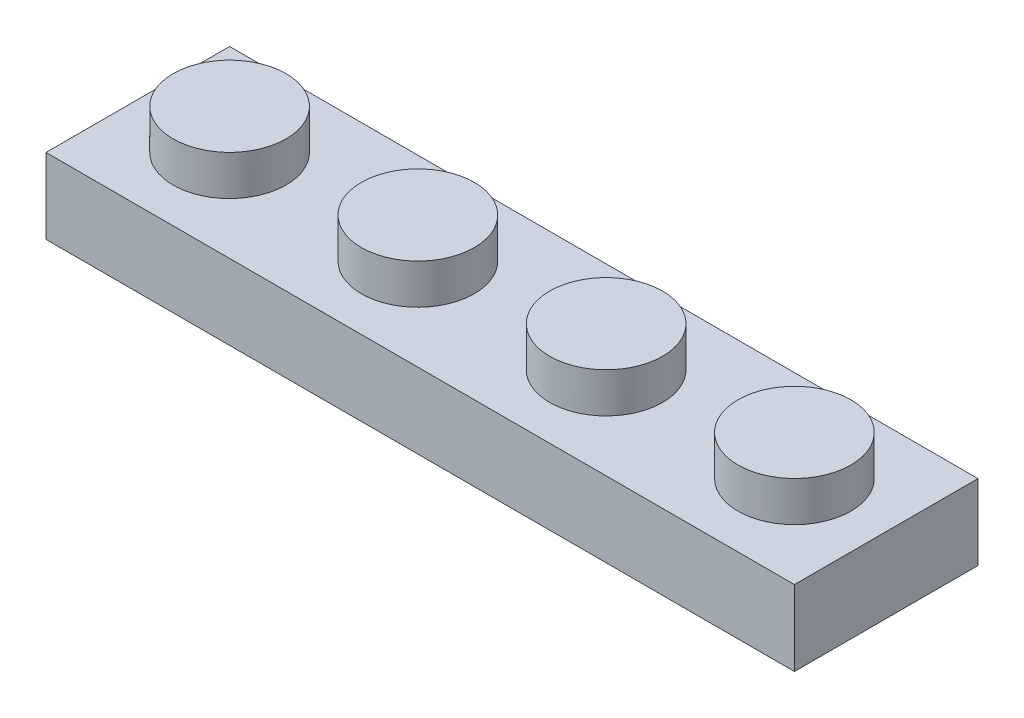
ISO-10303-21;
HEADER;
FILE_DESCRIPTION(('STEP AP214'),'2;1');
FILE_NAME('part.step','',(''),(''),'','','');
FILE_SCHEMA(('AUTOMOTIVE_DESIGN { 1 0 10303 214 1 1 1 1 }'));
ENDSEC;
DATA;
#1=APPLICATION_CONTEXT('core data for automotive mechanical design processes');
#2=APPLICATION_PROTOCOL_DEFINITION('international standard','automotive_design',2000,#1);
#3=PRODUCT_CONTEXT('',#1,'mechanical');
#4=PRODUCT('Part','Part','',(#3));
#5=PRODUCT_RELATED_PRODUCT_CATEGORY('part','',(#4));
#6=PRODUCT_DEFINITION_FORMATION('','',#4);
#7=PRODUCT_DEFINITION_CONTEXT('part definition',#1,'design');
#8=PRODUCT_DEFINITION('design','',#6,#7);
#9=PRODUCT_DEFINITION_SHAPE('','',#8);
#10=(LENGTH_UNIT() NAMED_UNIT(*) SI_UNIT(.MILLI.,.METRE.));
#11=(NAMED_UNIT(*) PLANE_ANGLE_UNIT() SI_UNIT($,.RADIAN.));
#12=(NAMED_UNIT(*) SI_UNIT($,.STERADIAN.) SOLID_ANGLE_UNIT());
#13=UNCERTAINTY_MEASURE_WITH_UNIT(LENGTH_MEASURE(1.E-05),#10,'distance_accuracy_value','');
#14=(GEOMETRIC_REPRESENTATION_CONTEXT(3) GLOBAL_UNCERTAINTY_ASSIGNED_CONTEXT((#13)) GLOBAL_UNIT_ASSIGNED_CONTEXT((#10,
#11,#12)) REPRESENTATION_CONTEXT('',''));
#15=CARTESIAN_POINT('',(0.,0.,0.));
#16=DIRECTION('',(0.,0.,1.));
#17=DIRECTION('',(1.,0.,0.));
#18=AXIS2_PLACEMENT_3D('',#15,#16,#17);
#19=CARTESIAN_POINT('',(27.9,4.9,-3.9));
#20=DIRECTION('',(0.,1.,0.));
#21=DIRECTION('',(0.,0.,1.));
#22=AXIS2_PLACEMENT_3D('',#19,#20,#21);
#23=PLANE('',#22);
#24=CARTESIAN_POINT('',(27.9,4.9,-3.9));
#25=DIRECTION('',(0.,1.,0.));
#26=DIRECTION('',(0.,0.,1.));
#27=AXIS2_PLACEMENT_3D('',#24,#25,#26);
#28=CIRCLE('',#27,2.4);
#29=CARTESIAN_POINT('',(27.9,4.9,-1.5));
#30=VERTEX_POINT('',#29);
#31=EDGE_CURVE('E11',#30,#30,#28,.T.);
#32=ORIENTED_EDGE('',*,*,#31,.T.);
#33=EDGE_LOOP('',(#32));
#34=FACE_BOUND('',#33,.T.);
#35=ADVANCED_FACE('F37',(#34),#23,.T.);
#36=CARTESIAN_POINT('',(27.9,4.9,-3.9));
#37=DIRECTION('',(0.,-1.,0.));
#38=DIRECTION('',(0.,0.,-1.));
#39=AXIS2_PLACEMENT_3D('',#36,#37,#38);
#40=CYLINDRICAL_SURFACE('',#39,2.4);
#41=ORIENTED_EDGE('',*,*,#31,.F.);
#42=EDGE_LOOP('',(#41));
#43=FACE_BOUND('',#42,.T.);
#44=CARTESIAN_POINT('',(27.9,3.2,-3.9));
#45=DIRECTION('',(0.,-1.,0.));
#46=DIRECTION('',(0.,0.,-1.));
#47=AXIS2_PLACEMENT_3D('',#44,#45,#46);
#48=CIRCLE('',#47,2.4);
#49=CARTESIAN_POINT('',(27.9,3.2,-6.3));
#50=VERTEX_POINT('',#49);
#51=EDGE_CURVE('E45',#50,#50,#48,.F.);
#52=ORIENTED_EDGE('',*,*,#51,.T.);
#53=EDGE_LOOP('',(#52));
#54=FACE_BOUND('',#53,.T.);
#55=ADVANCED_FACE('F129',(#43,#54),#40,.T.);
#56=CARTESIAN_POINT('',(19.9,4.9,-3.9));
#57=DIRECTION('',(0.,1.,0.));
#58=DIRECTION('',(0.,0.,1.));
#59=AXIS2_PLACEMENT_3D('',#56,#57,#58);
#60=PLANE('',#59);
#61=CARTESIAN_POINT('',(19.9,4.9,-3.9));
#62=DIRECTION('',(0.,1.,0.));
#63=DIRECTION('',(0.,0.,1.));
#64=AXIS2_PLACEMENT_3D('',#61,#62,#63);
#65=CIRCLE('',#64,2.4);
#66=CARTESIAN_POINT('',(19.9,4.9,-1.5));
#67=VERTEX_POINT('',#66);
#68=EDGE_CURVE('E124',#67,#67,#65,.T.);
#69=ORIENTED_EDGE('',*,*,#68,.T.);
#70=EDGE_LOOP('',(#69));
#71=FACE_BOUND('',#70,.T.);
#72=ADVANCED_FACE('F152',(#71),#60,.T.);
#73=CARTESIAN_POINT('',(19.9,4.9,-3.9));
#74=DIRECTION('',(0.,-1.,0.));
#75=DIRECTION('',(0.,0.,-1.));
#76=AXIS2_PLACEMENT_3D('',#73,#74,#75);
#77=CYLINDRICAL_SURFACE('',#76,2.4);
#78=ORIENTED_EDGE('',*,*,#68,.F.);
#79=EDGE_LOOP('',(#78));
#80=FACE_BOUND('',#79,.T.);
#81=CARTESIAN_POINT('',(19.9,3.2,-3.9));
#82=DIRECTION('',(0.,-1.,0.));
#83=DIRECTION('',(0.,0.,-1.));
#84=AXIS2_PLACEMENT_3D('',#81,#82,#83);
#85=CIRCLE('',#84,2.4);
#86=CARTESIAN_POINT('',(19.9,3.2,-6.3));
#87=VERTEX_POINT('',#86);
#88=EDGE_CURVE('E121',#87,#87,#85,.F.);
#89=ORIENTED_EDGE('',*,*,#88,.T.);
#90=EDGE_LOOP('',(#89));
#91=FACE_BOUND('',#90,.T.);
#92=ADVANCED_FACE('F158',(#80,#91),#77,.T.);
#93=CARTESIAN_POINT('',(0.,3.2,0.));
#94=DIRECTION('',(1.,0.,0.));
#95=DIRECTION('',(0.,0.,-1.));
#96=AXIS2_PLACEMENT_3D('',#93,#94,#95);
#97=PLANE('',#96);
#98=DIRECTION('',(0.,0.,1.));
#99=VECTOR('',#98,1.);
#100=CARTESIAN_POINT('',(0.,0.,0.));
#101=LINE('',#100,#99);
#102=CARTESIAN_POINT('',(0.,0.,-7.8));
#103=VERTEX_POINT('',#102);
#104=CARTESIAN_POINT('',(0.,0.,0.));
#105=VERTEX_POINT('',#104);
#106=EDGE_CURVE('E105',#103,#105,#101,.T.);
#107=ORIENTED_EDGE('',*,*,#106,.T.);
#108=DIRECTION('',(0.,-1.,0.));
#109=VECTOR('',#108,1.);
#110=CARTESIAN_POINT('',(0.,3.2,0.));
#111=LINE('',#110,#109);
#112=CARTESIAN_POINT('',(0.,3.2,0.));
#113=VERTEX_POINT('',#112);
#114=EDGE_CURVE('E96',#113,#105,#111,.T.);
#115=ORIENTED_EDGE('',*,*,#114,.F.);
#116=DIRECTION('',(0.,0.,1.));
#117=VECTOR('',#116,1.);
#118=CARTESIAN_POINT('',(0.,3.2,0.));
#119=LINE('',#118,#117);
#120=CARTESIAN_POINT('',(0.,3.2,-7.8));
#121=VERTEX_POINT('',#120);
#122=EDGE_CURVE('E90',#121,#113,#119,.T.);
#123=ORIENTED_EDGE('',*,*,#122,.F.);
#124=DIRECTION('',(0.,-1.,0.));
#125=VECTOR('',#124,1.);
#126=CARTESIAN_POINT('',(0.,3.2,-7.8));
#127=LINE('',#126,#125);
#128=EDGE_CURVE('E101',#121,#103,#127,.T.);
#129=ORIENTED_EDGE('',*,*,#128,.T.);
#130=EDGE_LOOP('',(#107,#115,#123,#129));
#131=FACE_BOUND('',#130,.T.);
#132=ADVANCED_FACE('F164',(#131),#97,.F.);
#133=CARTESIAN_POINT('',(0.,3.2,0.));
#134=DIRECTION('',(0.,0.,-1.));
#135=DIRECTION('',(-1.,0.,0.));
#136=AXIS2_PLACEMENT_3D('',#133,#134,#135);
#137=PLANE('',#136);
#138=DIRECTION('',(1.,0.,0.));
#139=VECTOR('',#138,1.);
#140=CARTESIAN_POINT('',(0.,0.,0.));
#141=LINE('',#140,#139);
#142=CARTESIAN_POINT('',(31.8,0.,0.));
#143=VERTEX_POINT('',#142);
#144=EDGE_CURVE('E95',#105,#143,#141,.T.);
#145=ORIENTED_EDGE('',*,*,#144,.T.);
#146=DIRECTION('',(0.,-1.,0.));
#147=VECTOR('',#146,1.);
#148=CARTESIAN_POINT('',(31.8,3.2,0.));
#149=LINE('',#148,#147);
#150=CARTESIAN_POINT('',(31.8,3.2,0.));
#151=VERTEX_POINT('',#150);
#152=EDGE_CURVE('E93',#151,#143,#149,.T.);
#153=ORIENTED_EDGE('',*,*,#152,.F.);
#154=DIRECTION('',(1.,0.,0.));
#155=VECTOR('',#154,1.);
#156=CARTESIAN_POINT('',(0.,3.2,0.));
#157=LINE('',#156,#155);
#158=EDGE_CURVE('E84',#113,#151,#157,.T.);
#159=ORIENTED_EDGE('',*,*,#158,.F.);
#160=ORIENTED_EDGE('',*,*,#114,.T.);
#161=EDGE_LOOP('',(#145,#153,#159,#160));
#162=FACE_BOUND('',#161,.T.);
#163=ADVANCED_FACE('F94',(#162),#137,.F.);
#164=CARTESIAN_POINT('',(31.8,3.2,0.));
#165=DIRECTION('',(-1.,0.,0.));
#166=DIRECTION('',(0.,0.,1.));
#167=AXIS2_PLACEMENT_3D('',#164,#165,#166);
#168=PLANE('',#167);
#169=DIRECTION('',(0.,0.,-1.));
#170=VECTOR('',#169,1.);
#171=CARTESIAN_POINT('',(31.8,0.,0.));
#172=LINE('',#171,#170);
#173=CARTESIAN_POINT('',(31.8,0.,-7.8));
#174=VERTEX_POINT('',#173);
#175=EDGE_CURVE('E70',#143,#174,#172,.T.);
#176=ORIENTED_EDGE('',*,*,#175,.T.);
#177=DIRECTION('',(0.,-1.,0.));
#178=VECTOR('',#177,1.);
#179=CARTESIAN_POINT('',(31.8,3.2,-7.8));
#180=LINE('',#179,#178);
#181=CARTESIAN_POINT('',(31.8,3.2,-7.8));
#182=VERTEX_POINT('',#181);
#183=EDGE_CURVE('E97',#182,#174,#180,.T.);
#184=ORIENTED_EDGE('',*,*,#183,.F.);
#185=DIRECTION('',(0.,0.,-1.));
#186=VECTOR('',#185,1.);
#187=CARTESIAN_POINT('',(31.8,3.2,0.));
#188=LINE('',#187,#186);
#189=EDGE_CURVE('E88',#151,#182,#188,.T.);
#190=ORIENTED_EDGE('',*,*,#189,.F.);
#191=ORIENTED_EDGE('',*,*,#152,.T.);
#192=EDGE_LOOP('',(#176,#184,#190,#191));
#193=FACE_BOUND('',#192,.T.);
#194=ADVANCED_FACE('F99',(#193),#168,.F.);
#195=CARTESIAN_POINT('',(0.,3.2,-7.8));
#196=DIRECTION('',(0.,0.,1.));
#197=DIRECTION('',(1.,0.,0.));
#198=AXIS2_PLACEMENT_3D('',#195,#196,#197);
#199=PLANE('',#198);
#200=DIRECTION('',(-1.,0.,0.));
#201=VECTOR('',#200,1.);
#202=CARTESIAN_POINT('',(0.,0.,-7.8));
#203=LINE('',#202,#201);
#204=EDGE_CURVE('E76',#174,#103,#203,.T.);
#205=ORIENTED_EDGE('',*,*,#204,.T.);
#206=ORIENTED_EDGE('',*,*,#128,.F.);
#207=DIRECTION('',(-1.,0.,0.));
#208=VECTOR('',#207,1.);
#209=CARTESIAN_POINT('',(0.,3.2,-7.8));
#210=LINE('',#209,#208);
#211=EDGE_CURVE('E53',#182,#121,#210,.T.);
#212=ORIENTED_EDGE('',*,*,#211,.F.);
#213=ORIENTED_EDGE('',*,*,#183,.T.);
#214=EDGE_LOOP('',(#205,#206,#212,#213));
#215=FACE_BOUND('',#214,.T.);
#216=ADVANCED_FACE('F133',(#215),#199,.F.);
#217=CARTESIAN_POINT('',(0.,3.2,0.));
#218=DIRECTION('',(0.,-1.,0.));
#219=DIRECTION('',(0.,0.,-1.));
#220=AXIS2_PLACEMENT_3D('',#217,#218,#219);
#221=PLANE('',#220);
#222=CARTESIAN_POINT('',(11.9,3.2,-3.9));
#223=DIRECTION('',(0.,-1.,0.));
#224=DIRECTION('',(0.,0.,-1.));
#225=AXIS2_PLACEMENT_3D('',#222,#223,#224);
#226=CIRCLE('',#225,2.4);
#227=CARTESIAN_POINT('',(11.9,3.2,-6.3));
#228=VERTEX_POINT('',#227);
#229=EDGE_CURVE('E118',#228,#228,#226,.F.);
#230=ORIENTED_EDGE('',*,*,#229,.F.);
#231=EDGE_LOOP('',(#230));
#232=FACE_BOUND('',#231,.T.);
#233=CARTESIAN_POINT('',(3.9,3.2,-3.9));
#234=DIRECTION('',(0.,-1.,0.));
#235=DIRECTION('',(0.,0.,-1.));
#236=AXIS2_PLACEMENT_3D('',#233,#234,#235);
#237=CIRCLE('',#236,2.4);
#238=CARTESIAN_POINT('',(3.9,3.2,-6.3));
#239=VERTEX_POINT('',#238);
#240=EDGE_CURVE('E115',#239,#239,#237,.F.);
#241=ORIENTED_EDGE('',*,*,#240,.F.);
#242=EDGE_LOOP('',(#241));
#243=FACE_BOUND('',#242,.T.);
#244=ORIENTED_EDGE('',*,*,#122,.T.);
#245=ORIENTED_EDGE('',*,*,#158,.T.);
#246=ORIENTED_EDGE('',*,*,#189,.T.);
#247=ORIENTED_EDGE('',*,*,#211,.T.);
#248=EDGE_LOOP('',(#244,#245,#246,#247));
#249=FACE_BOUND('',#248,.T.);
#250=ORIENTED_EDGE('',*,*,#88,.F.);
#251=EDGE_LOOP('',(#250));
#252=FACE_BOUND('',#251,.T.);
#253=ORIENTED_EDGE('',*,*,#51,.F.);
#254=EDGE_LOOP('',(#253));
#255=FACE_BOUND('',#254,.T.);
#256=ADVANCED_FACE('F85',(#232,#243,#249,#252,#255),#221,.F.);
#257=CARTESIAN_POINT('',(0.,0.,0.));
#258=DIRECTION('',(0.,-1.,0.));
#259=DIRECTION('',(0.,0.,-1.));
#260=AXIS2_PLACEMENT_3D('',#257,#258,#259);
#261=PLANE('',#260);
#262=ORIENTED_EDGE('',*,*,#106,.F.);
#263=ORIENTED_EDGE('',*,*,#204,.F.);
#264=ORIENTED_EDGE('',*,*,#175,.F.);
#265=ORIENTED_EDGE('',*,*,#144,.F.);
#266=EDGE_LOOP('',(#262,#263,#264,#265));
#267=FACE_BOUND('',#266,.T.);
#268=ADVANCED_FACE('F132',(#267),#261,.T.);
#269=CARTESIAN_POINT('',(3.9,4.9,-3.9));
#270=DIRECTION('',(0.,-1.,0.));
#271=DIRECTION('',(0.,0.,-1.));
#272=AXIS2_PLACEMENT_3D('',#269,#270,#271);
#273=CYLINDRICAL_SURFACE('',#272,2.4);
#274=CARTESIAN_POINT('',(3.9,4.9,-3.9));
#275=DIRECTION('',(0.,1.,0.));
#276=DIRECTION('',(0.,0.,1.));
#277=AXIS2_PLACEMENT_3D('',#274,#275,#276);
#278=CIRCLE('',#277,2.4);
#279=CARTESIAN_POINT('',(3.9,4.9,-1.5));
#280=VERTEX_POINT('',#279);
#281=EDGE_CURVE('E108',#280,#280,#278,.T.);
#282=ORIENTED_EDGE('',*,*,#281,.F.);
#283=EDGE_LOOP('',(#282));
#284=FACE_BOUND('',#283,.T.);
#285=ORIENTED_EDGE('',*,*,#240,.T.);
#286=EDGE_LOOP('',(#285));
#287=FACE_BOUND('',#286,.T.);
#288=ADVANCED_FACE('F140',(#284,#287),#273,.T.);
#289=CARTESIAN_POINT('',(3.9,4.9,-3.9));
#290=DIRECTION('',(0.,1.,0.));
#291=DIRECTION('',(0.,0.,1.));
#292=AXIS2_PLACEMENT_3D('',#289,#290,#291);
#293=PLANE('',#292);
#294=ORIENTED_EDGE('',*,*,#281,.T.);
#295=EDGE_LOOP('',(#294));
#296=FACE_BOUND('',#295,.T.);
#297=ADVANCED_FACE('F196',(#296),#293,.T.);
#298=CARTESIAN_POINT('',(11.9,4.9,-3.9));
#299=DIRECTION('',(0.,-1.,0.));
#300=DIRECTION('',(0.,0.,-1.));
#301=AXIS2_PLACEMENT_3D('',#298,#299,#300);
#302=CYLINDRICAL_SURFACE('',#301,2.4);
#303=CARTESIAN_POINT('',(11.9,4.9,-3.9));
#304=DIRECTION('',(0.,1.,0.));
#305=DIRECTION('',(0.,0.,1.));
#306=AXIS2_PLACEMENT_3D('',#303,#304,#305);
#307=CIRCLE('',#306,2.4);
#308=CARTESIAN_POINT('',(11.9,4.9,-1.5));
#309=VERTEX_POINT('',#308);
#310=EDGE_CURVE('E272',#309,#309,#307,.T.);
#311=ORIENTED_EDGE('',*,*,#310,.F.);
#312=EDGE_LOOP('',(#311));
#313=FACE_BOUND('',#312,.T.);
#314=ORIENTED_EDGE('',*,*,#229,.T.);
#315=EDGE_LOOP('',(#314));
#316=FACE_BOUND('',#315,.T.);
#317=ADVANCED_FACE('F203',(#313,#316),#302,.T.);
#318=CARTESIAN_POINT('',(11.9,4.9,-3.9));
#319=DIRECTION('',(0.,1.,0.));
#320=DIRECTION('',(0.,0.,1.));
#321=AXIS2_PLACEMENT_3D('',#318,#319,#320);
#322=PLANE('',#321);
#323=ORIENTED_EDGE('',*,*,#310,.T.);
#324=EDGE_LOOP('',(#323));
#325=FACE_BOUND('',#324,.T.);
#326=ADVANCED_FACE('F210',(#325),#322,.T.);
#327=CLOSED_SHELL('',(#35,#55,#72,#92,#132,#163,#194,#216,#256,#268,#288,#297,#317,#326));
#328=MANIFOLD_SOLID_BREP('B2',#327);
#329=ADVANCED_BREP_SHAPE_REPRESENTATION('',(#18,#328),#14);
#330=SHAPE_DEFINITION_REPRESENTATION(#9,#329);
ENDSEC;
END-ISO-10303-21;
